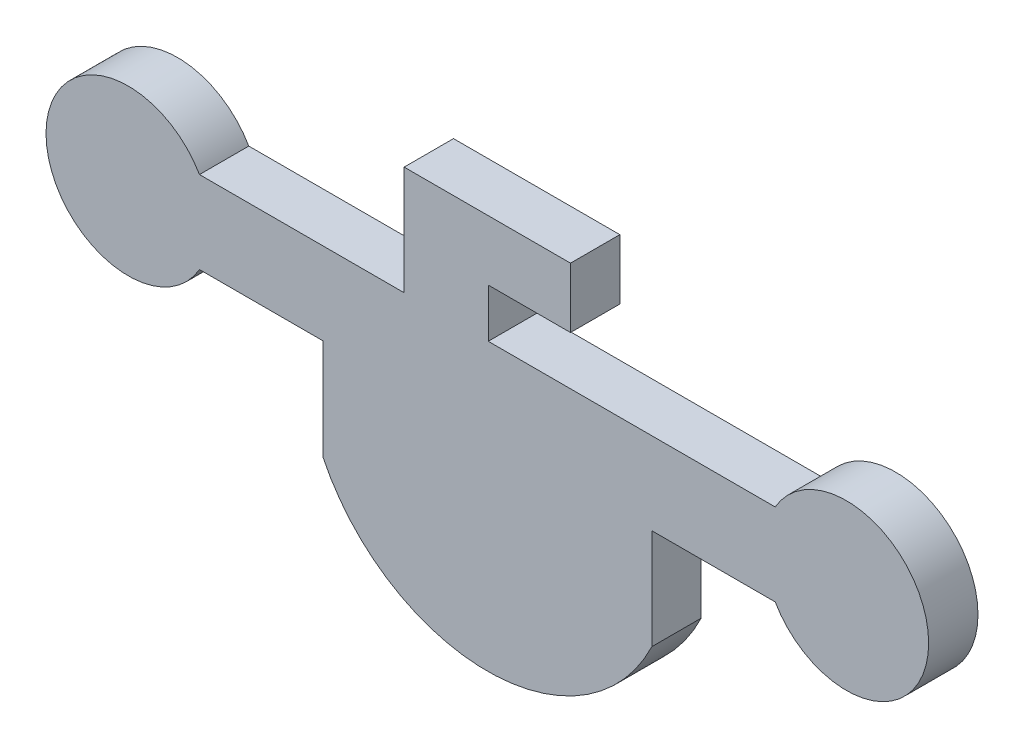
ISO-10303-21;
HEADER;
FILE_DESCRIPTION(('STEP AP214'),'2;1');
FILE_NAME('part.step','',(''),(''),'','','');
FILE_SCHEMA(('AUTOMOTIVE_DESIGN { 1 0 10303 214 1 1 1 1 }'));
ENDSEC;
DATA;
#1=APPLICATION_CONTEXT('core data for automotive mechanical design processes');
#2=APPLICATION_PROTOCOL_DEFINITION('international standard','automotive_design',2000,#1);
#3=PRODUCT_CONTEXT('',#1,'mechanical');
#4=PRODUCT('Part','Part','',(#3));
#5=PRODUCT_RELATED_PRODUCT_CATEGORY('part','',(#4));
#6=PRODUCT_DEFINITION_FORMATION('','',#4);
#7=PRODUCT_DEFINITION_CONTEXT('part definition',#1,'design');
#8=PRODUCT_DEFINITION('design','',#6,#7);
#9=PRODUCT_DEFINITION_SHAPE('','',#8);
#10=(LENGTH_UNIT() NAMED_UNIT(*) SI_UNIT(.MILLI.,.METRE.));
#11=(NAMED_UNIT(*) PLANE_ANGLE_UNIT() SI_UNIT($,.RADIAN.));
#12=(NAMED_UNIT(*) SI_UNIT($,.STERADIAN.) SOLID_ANGLE_UNIT());
#13=UNCERTAINTY_MEASURE_WITH_UNIT(LENGTH_MEASURE(1.E-05),#10,'distance_accuracy_value','');
#14=(GEOMETRIC_REPRESENTATION_CONTEXT(3) GLOBAL_UNCERTAINTY_ASSIGNED_CONTEXT((#13)) GLOBAL_UNIT_ASSIGNED_CONTEXT((#10,
#11,#12)) REPRESENTATION_CONTEXT('',''));
#15=CARTESIAN_POINT('',(0.,0.,0.));
#16=DIRECTION('',(0.,0.,1.));
#17=DIRECTION('',(1.,0.,0.));
#18=AXIS2_PLACEMENT_3D('',#15,#16,#17);
#19=CARTESIAN_POINT('',(-1351.28018653171,93.8998201263411,3.00000000000025));
#20=DIRECTION('',(1.,0.,0.));
#21=DIRECTION('',(0.,0.,-1.));
#22=AXIS2_PLACEMENT_3D('',#19,#20,#21);
#23=PLANE('',#22);
#24=DIRECTION('',(0.,-1.,0.));
#25=VECTOR('',#24,1.);
#26=CARTESIAN_POINT('',(-1351.28018653171,93.8998201263414,1.94289029309402E-13));
#27=LINE('',#26,#25);
#28=CARTESIAN_POINT('',(-1351.28018653171,100.515097097471,1.94289029309402E-13));
#29=VERTEX_POINT('',#28);
#30=CARTESIAN_POINT('',(-1351.28018653171,93.8998201263414,1.94289029309402E-13));
#31=VERTEX_POINT('',#30);
#32=EDGE_CURVE('E136',#29,#31,#27,.T.);
#33=ORIENTED_EDGE('',*,*,#32,.T.);
#34=DIRECTION('',(0.,0.,-1.));
#35=VECTOR('',#34,1.);
#36=CARTESIAN_POINT('',(-1351.28018653171,93.8998201263411,3.00000000000025));
#37=LINE('',#36,#35);
#38=CARTESIAN_POINT('',(-1351.28018653171,93.8998201263411,3.00000000000025));
#39=VERTEX_POINT('',#38);
#40=EDGE_CURVE('E11',#39,#31,#37,.T.);
#41=ORIENTED_EDGE('',*,*,#40,.F.);
#42=DIRECTION('',(0.,-1.,0.));
#43=VECTOR('',#42,1.);
#44=CARTESIAN_POINT('',(-1351.28018653171,93.8998201263411,3.00000000000025));
#45=LINE('',#44,#43);
#46=CARTESIAN_POINT('',(-1351.2801865317,100.515097097471,3.00000000000017));
#47=VERTEX_POINT('',#46);
#48=EDGE_CURVE('E175',#47,#39,#45,.T.);
#49=ORIENTED_EDGE('',*,*,#48,.F.);
#50=DIRECTION('',(0.,0.,-1.));
#51=VECTOR('',#50,1.);
#52=CARTESIAN_POINT('',(-1351.2801865317,100.515097097471,3.00000000000017));
#53=LINE('',#52,#51);
#54=EDGE_CURVE('E149',#47,#29,#53,.T.);
#55=ORIENTED_EDGE('',*,*,#54,.T.);
#56=EDGE_LOOP('',(#33,#41,#49,#55));
#57=FACE_BOUND('',#56,.T.);
#58=ADVANCED_FACE('F32',(#57),#23,.F.);
#59=CARTESIAN_POINT('',(-1363.72354833003,93.8998201263413,3.00000000000034));
#60=DIRECTION('',(0.,-1.,0.));
#61=DIRECTION('',(0.,0.,-1.));
#62=AXIS2_PLACEMENT_3D('',#59,#60,#61);
#63=PLANE('',#62);
#64=DIRECTION('',(-1.,0.,0.));
#65=VECTOR('',#64,1.);
#66=CARTESIAN_POINT('',(-1363.72354833003,93.8998201263413,2.4980018054066E-13));
#67=LINE('',#66,#65);
#68=CARTESIAN_POINT('',(-1363.72354833003,93.8998201263413,2.4980018054066E-13));
#69=VERTEX_POINT('',#68);
#70=EDGE_CURVE('E132',#31,#69,#67,.T.);
#71=ORIENTED_EDGE('',*,*,#70,.T.);
#72=DIRECTION('',(0.,0.,-1.));
#73=VECTOR('',#72,1.);
#74=CARTESIAN_POINT('',(-1363.72354833003,93.8998201263413,3.00000000000034));
#75=LINE('',#74,#73);
#76=CARTESIAN_POINT('',(-1363.72354833003,93.8998201263413,3.00000000000034));
#77=VERTEX_POINT('',#76);
#78=EDGE_CURVE('E39',#77,#69,#75,.T.);
#79=ORIENTED_EDGE('',*,*,#78,.F.);
#80=DIRECTION('',(-1.,0.,0.));
#81=VECTOR('',#80,1.);
#82=CARTESIAN_POINT('',(-1363.72354833003,93.8998201263413,3.00000000000034));
#83=LINE('',#82,#81);
#84=EDGE_CURVE('E145',#39,#77,#83,.T.);
#85=ORIENTED_EDGE('',*,*,#84,.F.);
#86=ORIENTED_EDGE('',*,*,#40,.T.);
#87=EDGE_LOOP('',(#71,#79,#85,#86));
#88=FACE_BOUND('',#87,.T.);
#89=ADVANCED_FACE('F144',(#88),#63,.F.);
#90=CARTESIAN_POINT('',(-1368.05367534895,91.3998201263413,3.00000000000025));
#91=DIRECTION('',(0.,0.,-1.));
#92=DIRECTION('',(-1.,0.,0.));
#93=AXIS2_PLACEMENT_3D('',#90,#91,#92);
#94=CYLINDRICAL_SURFACE('',#93,5.00000000000002);
#95=CARTESIAN_POINT('',(-1368.05367534895,91.3998201263412,2.4980018054066E-13));
#96=DIRECTION('',(0.,0.,1.));
#97=DIRECTION('',(1.,0.,0.));
#98=AXIS2_PLACEMENT_3D('',#95,#96,#97);
#99=CIRCLE('',#98,5.00000000000002);
#100=CARTESIAN_POINT('',(-1363.72354833003,88.8998201263413,2.4980018054066E-13));
#101=VERTEX_POINT('',#100);
#102=EDGE_CURVE('E138',#69,#101,#99,.T.);
#103=ORIENTED_EDGE('',*,*,#102,.T.);
#104=DIRECTION('',(0.,0.,-1.));
#105=VECTOR('',#104,1.);
#106=CARTESIAN_POINT('',(-1363.72354833003,88.8998201263413,3.00000000000028));
#107=LINE('',#106,#105);
#108=CARTESIAN_POINT('',(-1363.72354833003,88.8998201263413,3.00000000000028));
#109=VERTEX_POINT('',#108);
#110=EDGE_CURVE('E231',#109,#101,#107,.T.);
#111=ORIENTED_EDGE('',*,*,#110,.F.);
#112=CARTESIAN_POINT('',(-1368.05367534895,91.3998201263413,3.00000000000025));
#113=DIRECTION('',(0.,0.,1.));
#114=DIRECTION('',(1.,0.,0.));
#115=AXIS2_PLACEMENT_3D('',#112,#113,#114);
#116=CIRCLE('',#115,5.00000000000002);
#117=EDGE_CURVE('E178',#77,#109,#116,.T.);
#118=ORIENTED_EDGE('',*,*,#117,.F.);
#119=ORIENTED_EDGE('',*,*,#78,.T.);
#120=EDGE_LOOP('',(#103,#111,#118,#119));
#121=FACE_BOUND('',#120,.T.);
#122=ADVANCED_FACE('F235',(#121),#94,.T.);
#123=CARTESIAN_POINT('',(-1363.72354833003,88.8998201263413,3.00000000000028));
#124=DIRECTION('',(0.,1.,0.));
#125=DIRECTION('',(0.,0.,1.));
#126=AXIS2_PLACEMENT_3D('',#123,#124,#125);
#127=PLANE('',#126);
#128=DIRECTION('',(1.,0.,0.));
#129=VECTOR('',#128,1.);
#130=CARTESIAN_POINT('',(-1363.72354833003,88.8998201263413,2.4980018054066E-13));
#131=LINE('',#130,#129);
#132=CARTESIAN_POINT('',(-1356.22354833003,88.8998201263413,3.33066907387547E-13));
#133=VERTEX_POINT('',#132);
#134=EDGE_CURVE('E153',#101,#133,#131,.T.);
#135=ORIENTED_EDGE('',*,*,#134,.T.);
#136=DIRECTION('',(0.,0.,-1.));
#137=VECTOR('',#136,1.);
#138=CARTESIAN_POINT('',(-1356.22354833003,88.8998201263413,3.00000000000028));
#139=LINE('',#138,#137);
#140=CARTESIAN_POINT('',(-1356.22354833003,88.8998201263413,3.00000000000028));
#141=VERTEX_POINT('',#140);
#142=EDGE_CURVE('E228',#141,#133,#139,.T.);
#143=ORIENTED_EDGE('',*,*,#142,.F.);
#144=DIRECTION('',(1.,0.,0.));
#145=VECTOR('',#144,1.);
#146=CARTESIAN_POINT('',(-1363.72354833003,88.8998201263413,3.00000000000028));
#147=LINE('',#146,#145);
#148=EDGE_CURVE('E180',#109,#141,#147,.T.);
#149=ORIENTED_EDGE('',*,*,#148,.F.);
#150=ORIENTED_EDGE('',*,*,#110,.T.);
#151=EDGE_LOOP('',(#135,#143,#149,#150));
#152=FACE_BOUND('',#151,.T.);
#153=ADVANCED_FACE('F243',(#152),#127,.F.);
#154=CARTESIAN_POINT('',(-1356.22354833003,82.7934375151063,3.00000000000017));
#155=DIRECTION('',(1.,0.,0.));
#156=DIRECTION('',(0.,0.,-1.));
#157=AXIS2_PLACEMENT_3D('',#154,#155,#156);
#158=PLANE('',#157);
#159=DIRECTION('',(0.,-1.,0.));
#160=VECTOR('',#159,1.);
#161=CARTESIAN_POINT('',(-1356.22354833003,82.7934375151063,3.33066907387547E-13));
#162=LINE('',#161,#160);
#163=CARTESIAN_POINT('',(-1356.22354833003,82.7934375151063,3.33066907387547E-13));
#164=VERTEX_POINT('',#163);
#165=EDGE_CURVE('E155',#133,#164,#162,.T.);
#166=ORIENTED_EDGE('',*,*,#165,.T.);
#167=DIRECTION('',(0.,0.,-1.));
#168=VECTOR('',#167,1.);
#169=CARTESIAN_POINT('',(-1356.22354833003,82.7934375151063,3.00000000000017));
#170=LINE('',#169,#168);
#171=CARTESIAN_POINT('',(-1356.22354833003,82.7934375151063,3.00000000000017));
#172=VERTEX_POINT('',#171);
#173=EDGE_CURVE('E225',#172,#164,#170,.T.);
#174=ORIENTED_EDGE('',*,*,#173,.F.);
#175=DIRECTION('',(0.,-1.,0.));
#176=VECTOR('',#175,1.);
#177=CARTESIAN_POINT('',(-1356.22354833003,82.7934375151063,3.00000000000017));
#178=LINE('',#177,#176);
#179=EDGE_CURVE('E182',#141,#172,#178,.T.);
#180=ORIENTED_EDGE('',*,*,#179,.F.);
#181=ORIENTED_EDGE('',*,*,#142,.T.);
#182=EDGE_LOOP('',(#166,#174,#180,#181));
#183=FACE_BOUND('',#182,.T.);
#184=ADVANCED_FACE('F246',(#183),#158,.F.);
#185=CARTESIAN_POINT('',(-1346.22354833003,87.5993501758886,3.00000000000045));
#186=DIRECTION('',(0.,0.,-1.));
#187=DIRECTION('',(-1.,0.,0.));
#188=AXIS2_PLACEMENT_3D('',#185,#186,#187);
#189=CYLINDRICAL_SURFACE('',#188,11.094899571563);
#190=CARTESIAN_POINT('',(-1346.22354833003,87.5993501758885,3.05311331771918E-13));
#191=DIRECTION('',(0.,0.,1.));
#192=DIRECTION('',(1.,0.,0.));
#193=AXIS2_PLACEMENT_3D('',#190,#191,#192);
#194=CIRCLE('',#193,11.094899571563);
#195=CARTESIAN_POINT('',(-1336.22354833003,82.7934375151063,4.44089209850063E-13));
#196=VERTEX_POINT('',#195);
#197=EDGE_CURVE('E157',#164,#196,#194,.T.);
#198=ORIENTED_EDGE('',*,*,#197,.T.);
#199=DIRECTION('',(0.,0.,-1.));
#200=VECTOR('',#199,1.);
#201=CARTESIAN_POINT('',(-1336.22354833003,82.7934375151063,3.00000000000039));
#202=LINE('',#201,#200);
#203=CARTESIAN_POINT('',(-1336.22354833003,82.7934375151063,3.00000000000039));
#204=VERTEX_POINT('',#203);
#205=EDGE_CURVE('E222',#204,#196,#202,.T.);
#206=ORIENTED_EDGE('',*,*,#205,.F.);
#207=CARTESIAN_POINT('',(-1346.22354833003,87.5993501758886,3.00000000000045));
#208=DIRECTION('',(0.,0.,1.));
#209=DIRECTION('',(1.,0.,0.));
#210=AXIS2_PLACEMENT_3D('',#207,#208,#209);
#211=CIRCLE('',#210,11.094899571563);
#212=EDGE_CURVE('E184',#172,#204,#211,.T.);
#213=ORIENTED_EDGE('',*,*,#212,.F.);
#214=ORIENTED_EDGE('',*,*,#173,.T.);
#215=EDGE_LOOP('',(#198,#206,#213,#214));
#216=FACE_BOUND('',#215,.T.);
#217=ADVANCED_FACE('F251',(#216),#189,.T.);
#218=CARTESIAN_POINT('',(-1336.22354833003,82.7934375151063,3.00000000000039));
#219=DIRECTION('',(-1.,0.,0.));
#220=DIRECTION('',(0.,0.,1.));
#221=AXIS2_PLACEMENT_3D('',#218,#219,#220);
#222=PLANE('',#221);
#223=DIRECTION('',(0.,1.,0.));
#224=VECTOR('',#223,1.);
#225=CARTESIAN_POINT('',(-1336.22354833003,82.7934375151063,4.44089209850063E-13));
#226=LINE('',#225,#224);
#227=CARTESIAN_POINT('',(-1336.22354833003,88.8998201263412,4.71844785465692E-13));
#228=VERTEX_POINT('',#227);
#229=EDGE_CURVE('E159',#196,#228,#226,.T.);
#230=ORIENTED_EDGE('',*,*,#229,.T.);
#231=DIRECTION('',(0.,0.,-1.));
#232=VECTOR('',#231,1.);
#233=CARTESIAN_POINT('',(-1336.22354833003,88.8998201263413,3.00000000000034));
#234=LINE('',#233,#232);
#235=CARTESIAN_POINT('',(-1336.22354833003,88.8998201263413,3.00000000000034));
#236=VERTEX_POINT('',#235);
#237=EDGE_CURVE('E219',#236,#228,#234,.T.);
#238=ORIENTED_EDGE('',*,*,#237,.F.);
#239=DIRECTION('',(0.,1.,0.));
#240=VECTOR('',#239,1.);
#241=CARTESIAN_POINT('',(-1336.22354833003,82.7934375151063,3.00000000000039));
#242=LINE('',#241,#240);
#243=EDGE_CURVE('E186',#204,#236,#242,.T.);
#244=ORIENTED_EDGE('',*,*,#243,.F.);
#245=ORIENTED_EDGE('',*,*,#205,.T.);
#246=EDGE_LOOP('',(#230,#238,#244,#245));
#247=FACE_BOUND('',#246,.T.);
#248=ADVANCED_FACE('F257',(#247),#222,.F.);
#249=CARTESIAN_POINT('',(-1336.22354833003,88.8998201263413,3.00000000000034));
#250=DIRECTION('',(0.,1.,0.));
#251=DIRECTION('',(0.,0.,1.));
#252=AXIS2_PLACEMENT_3D('',#249,#250,#251);
#253=PLANE('',#252);
#254=DIRECTION('',(1.,0.,0.));
#255=VECTOR('',#254,1.);
#256=CARTESIAN_POINT('',(-1336.22354833003,88.8998201263412,4.71844785465692E-13));
#257=LINE('',#256,#255);
#258=CARTESIAN_POINT('',(-1328.72354833003,88.8998201263412,1.11022302462516E-13));
#259=VERTEX_POINT('',#258);
#260=EDGE_CURVE('E161',#228,#259,#257,.T.);
#261=ORIENTED_EDGE('',*,*,#260,.T.);
#262=DIRECTION('',(0.,0.,-1.));
#263=VECTOR('',#262,1.);
#264=CARTESIAN_POINT('',(-1328.72354833003,88.8998201263413,3.00000000000017));
#265=LINE('',#264,#263);
#266=CARTESIAN_POINT('',(-1328.72354833003,88.8998201263413,3.00000000000017));
#267=VERTEX_POINT('',#266);
#268=EDGE_CURVE('E216',#267,#259,#265,.T.);
#269=ORIENTED_EDGE('',*,*,#268,.F.);
#270=DIRECTION('',(1.,0.,0.));
#271=VECTOR('',#270,1.);
#272=CARTESIAN_POINT('',(-1336.22354833003,88.8998201263413,3.00000000000034));
#273=LINE('',#272,#271);
#274=EDGE_CURVE('E188',#236,#267,#273,.T.);
#275=ORIENTED_EDGE('',*,*,#274,.F.);
#276=ORIENTED_EDGE('',*,*,#237,.T.);
#277=EDGE_LOOP('',(#261,#269,#275,#276));
#278=FACE_BOUND('',#277,.T.);
#279=ADVANCED_FACE('F261',(#278),#253,.F.);
#280=CARTESIAN_POINT('',(-1324.39342131111,91.3998201263414,3.00000000000014));
#281=DIRECTION('',(0.,0.,-1.));
#282=DIRECTION('',(-1.,0.,0.));
#283=AXIS2_PLACEMENT_3D('',#280,#281,#282);
#284=CYLINDRICAL_SURFACE('',#283,5.00000000000002);
#285=CARTESIAN_POINT('',(-1324.39342131111,91.3998201263413,1.94289029309402E-13));
#286=DIRECTION('',(0.,0.,1.));
#287=DIRECTION('',(-1.,0.,0.));
#288=AXIS2_PLACEMENT_3D('',#285,#286,#287);
#289=CIRCLE('',#288,5.00000000000002);
#290=CARTESIAN_POINT('',(-1328.72354833003,93.8998201263414,0.));
#291=VERTEX_POINT('',#290);
#292=EDGE_CURVE('E163',#259,#291,#289,.T.);
#293=ORIENTED_EDGE('',*,*,#292,.T.);
#294=DIRECTION('',(0.,0.,-1.));
#295=VECTOR('',#294,1.);
#296=CARTESIAN_POINT('',(-1328.72354833003,93.8998201263413,3.00000000000017));
#297=LINE('',#296,#295);
#298=CARTESIAN_POINT('',(-1328.72354833003,93.8998201263413,3.00000000000017));
#299=VERTEX_POINT('',#298);
#300=EDGE_CURVE('E213',#299,#291,#297,.T.);
#301=ORIENTED_EDGE('',*,*,#300,.F.);
#302=CARTESIAN_POINT('',(-1324.39342131111,91.3998201263414,3.00000000000014));
#303=DIRECTION('',(0.,0.,1.));
#304=DIRECTION('',(-1.,0.,0.));
#305=AXIS2_PLACEMENT_3D('',#302,#303,#304);
#306=CIRCLE('',#305,5.00000000000002);
#307=EDGE_CURVE('E190',#267,#299,#306,.T.);
#308=ORIENTED_EDGE('',*,*,#307,.F.);
#309=ORIENTED_EDGE('',*,*,#268,.T.);
#310=EDGE_LOOP('',(#293,#301,#308,#309));
#311=FACE_BOUND('',#310,.T.);
#312=ADVANCED_FACE('F266',(#311),#284,.T.);
#313=CARTESIAN_POINT('',(-1328.72354833003,93.8998201263413,3.00000000000017));
#314=DIRECTION('',(0.,-1.,0.));
#315=DIRECTION('',(0.,0.,-1.));
#316=AXIS2_PLACEMENT_3D('',#313,#314,#315);
#317=PLANE('',#316);
#318=DIRECTION('',(-1.,0.,0.));
#319=VECTOR('',#318,1.);
#320=CARTESIAN_POINT('',(-1328.72354833003,93.8998201263414,0.));
#321=LINE('',#320,#319);
#322=CARTESIAN_POINT('',(-1346.16691012836,93.8998201263413,1.38777878078145E-13));
#323=VERTEX_POINT('',#322);
#324=EDGE_CURVE('E165',#291,#323,#321,.T.);
#325=ORIENTED_EDGE('',*,*,#324,.T.);
#326=DIRECTION('',(0.,0.,-1.));
#327=VECTOR('',#326,1.);
#328=CARTESIAN_POINT('',(-1346.16691012836,93.8998201263414,3.00000000000014));
#329=LINE('',#328,#327);
#330=CARTESIAN_POINT('',(-1346.16691012836,93.8998201263414,3.00000000000014));
#331=VERTEX_POINT('',#330);
#332=EDGE_CURVE('E210',#331,#323,#329,.T.);
#333=ORIENTED_EDGE('',*,*,#332,.F.);
#334=DIRECTION('',(-1.,0.,0.));
#335=VECTOR('',#334,1.);
#336=CARTESIAN_POINT('',(-1328.72354833003,93.8998201263413,3.00000000000017));
#337=LINE('',#336,#335);
#338=EDGE_CURVE('E192',#299,#331,#337,.T.);
#339=ORIENTED_EDGE('',*,*,#338,.F.);
#340=ORIENTED_EDGE('',*,*,#300,.T.);
#341=EDGE_LOOP('',(#325,#333,#339,#340));
#342=FACE_BOUND('',#341,.T.);
#343=ADVANCED_FACE('F272',(#342),#317,.F.);
#344=CARTESIAN_POINT('',(-1346.16691012836,96.8610733291439,3.00000000000017));
#345=DIRECTION('',(-1.,0.,0.));
#346=DIRECTION('',(0.,0.,1.));
#347=AXIS2_PLACEMENT_3D('',#344,#345,#346);
#348=PLANE('',#347);
#349=DIRECTION('',(0.,1.,0.));
#350=VECTOR('',#349,1.);
#351=CARTESIAN_POINT('',(-1346.16691012836,96.8610733291438,1.66533453693773E-13));
#352=LINE('',#351,#350);
#353=CARTESIAN_POINT('',(-1346.16691012836,96.8610733291438,1.66533453693773E-13));
#354=VERTEX_POINT('',#353);
#355=EDGE_CURVE('E167',#323,#354,#352,.T.);
#356=ORIENTED_EDGE('',*,*,#355,.T.);
#357=DIRECTION('',(0.,0.,-1.));
#358=VECTOR('',#357,1.);
#359=CARTESIAN_POINT('',(-1346.16691012836,96.8610733291439,3.00000000000017));
#360=LINE('',#359,#358);
#361=CARTESIAN_POINT('',(-1346.16691012836,96.8610733291439,3.00000000000017));
#362=VERTEX_POINT('',#361);
#363=EDGE_CURVE('E207',#362,#354,#360,.T.);
#364=ORIENTED_EDGE('',*,*,#363,.F.);
#365=DIRECTION('',(0.,1.,0.));
#366=VECTOR('',#365,1.);
#367=CARTESIAN_POINT('',(-1346.16691012836,96.8610733291439,3.00000000000017));
#368=LINE('',#367,#366);
#369=EDGE_CURVE('E194',#331,#362,#368,.T.);
#370=ORIENTED_EDGE('',*,*,#369,.F.);
#371=ORIENTED_EDGE('',*,*,#332,.T.);
#372=EDGE_LOOP('',(#356,#364,#370,#371));
#373=FACE_BOUND('',#372,.T.);
#374=ADVANCED_FACE('F276',(#373),#348,.F.);
#375=CARTESIAN_POINT('',(-1341.16691012836,96.8610733291437,3.00000000000017));
#376=DIRECTION('',(0.,1.,0.));
#377=DIRECTION('',(0.,0.,1.));
#378=AXIS2_PLACEMENT_3D('',#375,#376,#377);
#379=PLANE('',#378);
#380=DIRECTION('',(1.,0.,0.));
#381=VECTOR('',#380,1.);
#382=CARTESIAN_POINT('',(-1341.16691012836,96.8610733291438,1.66533453693773E-13));
#383=LINE('',#382,#381);
#384=CARTESIAN_POINT('',(-1341.16691012836,96.8610733291438,1.66533453693773E-13));
#385=VERTEX_POINT('',#384);
#386=EDGE_CURVE('E169',#354,#385,#383,.T.);
#387=ORIENTED_EDGE('',*,*,#386,.T.);
#388=DIRECTION('',(0.,0.,-1.));
#389=VECTOR('',#388,1.);
#390=CARTESIAN_POINT('',(-1341.16691012836,96.8610733291437,3.00000000000017));
#391=LINE('',#390,#389);
#392=CARTESIAN_POINT('',(-1341.16691012836,96.8610733291437,3.00000000000017));
#393=VERTEX_POINT('',#392);
#394=EDGE_CURVE('E204',#393,#385,#391,.T.);
#395=ORIENTED_EDGE('',*,*,#394,.F.);
#396=DIRECTION('',(1.,0.,0.));
#397=VECTOR('',#396,1.);
#398=CARTESIAN_POINT('',(-1341.16691012836,96.8610733291437,3.00000000000017));
#399=LINE('',#398,#397);
#400=EDGE_CURVE('E196',#362,#393,#399,.T.);
#401=ORIENTED_EDGE('',*,*,#400,.F.);
#402=ORIENTED_EDGE('',*,*,#363,.T.);
#403=EDGE_LOOP('',(#387,#395,#401,#402));
#404=FACE_BOUND('',#403,.T.);
#405=ADVANCED_FACE('F281',(#404),#379,.F.);
#406=CARTESIAN_POINT('',(-1341.16691012836,100.515097097471,3.00000000000009));
#407=DIRECTION('',(-1.,0.,0.));
#408=DIRECTION('',(0.,0.,1.));
#409=AXIS2_PLACEMENT_3D('',#406,#407,#408);
#410=PLANE('',#409);
#411=DIRECTION('',(0.,1.,0.));
#412=VECTOR('',#411,1.);
#413=CARTESIAN_POINT('',(-1341.16691012836,100.515097097471,2.22044604925031E-13));
#414=LINE('',#413,#412);
#415=CARTESIAN_POINT('',(-1341.16691012836,100.515097097471,2.22044604925031E-13));
#416=VERTEX_POINT('',#415);
#417=EDGE_CURVE('E171',#385,#416,#414,.T.);
#418=ORIENTED_EDGE('',*,*,#417,.T.);
#419=DIRECTION('',(0.,0.,-1.));
#420=VECTOR('',#419,1.);
#421=CARTESIAN_POINT('',(-1341.16691012836,100.515097097471,3.00000000000009));
#422=LINE('',#421,#420);
#423=CARTESIAN_POINT('',(-1341.16691012836,100.515097097471,3.00000000000009));
#424=VERTEX_POINT('',#423);
#425=EDGE_CURVE('E201',#424,#416,#422,.T.);
#426=ORIENTED_EDGE('',*,*,#425,.F.);
#427=DIRECTION('',(0.,1.,0.));
#428=VECTOR('',#427,1.);
#429=CARTESIAN_POINT('',(-1341.16691012836,100.515097097471,3.00000000000009));
#430=LINE('',#429,#428);
#431=EDGE_CURVE('E51',#393,#424,#430,.T.);
#432=ORIENTED_EDGE('',*,*,#431,.F.);
#433=ORIENTED_EDGE('',*,*,#394,.T.);
#434=EDGE_LOOP('',(#418,#426,#432,#433));
#435=FACE_BOUND('',#434,.T.);
#436=ADVANCED_FACE('F284',(#435),#410,.F.);
#437=CARTESIAN_POINT('',(-1351.2801865317,100.515097097471,3.00000000000017));
#438=DIRECTION('',(0.,-1.,0.));
#439=DIRECTION('',(0.,0.,-1.));
#440=AXIS2_PLACEMENT_3D('',#437,#438,#439);
#441=PLANE('',#440);
#442=DIRECTION('',(-1.,0.,0.));
#443=VECTOR('',#442,1.);
#444=CARTESIAN_POINT('',(-1351.28018653171,100.515097097471,1.94289029309402E-13));
#445=LINE('',#444,#443);
#446=EDGE_CURVE('E173',#416,#29,#445,.T.);
#447=ORIENTED_EDGE('',*,*,#446,.T.);
#448=ORIENTED_EDGE('',*,*,#54,.F.);
#449=DIRECTION('',(-1.,0.,0.));
#450=VECTOR('',#449,1.);
#451=CARTESIAN_POINT('',(-1351.2801865317,100.515097097471,3.00000000000017));
#452=LINE('',#451,#450);
#453=EDGE_CURVE('E46',#424,#47,#452,.T.);
#454=ORIENTED_EDGE('',*,*,#453,.F.);
#455=ORIENTED_EDGE('',*,*,#425,.T.);
#456=EDGE_LOOP('',(#447,#448,#454,#455));
#457=FACE_BOUND('',#456,.T.);
#458=ADVANCED_FACE('F286',(#457),#441,.F.);
#459=CARTESIAN_POINT('',(-1324.39342131111,91.3998201263414,3.00000000000014));
#460=DIRECTION('',(0.,0.,-1.));
#461=DIRECTION('',(-1.,0.,0.));
#462=AXIS2_PLACEMENT_3D('',#459,#460,#461);
#463=PLANE('',#462);
#464=ORIENTED_EDGE('',*,*,#48,.T.);
#465=ORIENTED_EDGE('',*,*,#84,.T.);
#466=ORIENTED_EDGE('',*,*,#117,.T.);
#467=ORIENTED_EDGE('',*,*,#148,.T.);
#468=ORIENTED_EDGE('',*,*,#179,.T.);
#469=ORIENTED_EDGE('',*,*,#212,.T.);
#470=ORIENTED_EDGE('',*,*,#243,.T.);
#471=ORIENTED_EDGE('',*,*,#274,.T.);
#472=ORIENTED_EDGE('',*,*,#307,.T.);
#473=ORIENTED_EDGE('',*,*,#338,.T.);
#474=ORIENTED_EDGE('',*,*,#369,.T.);
#475=ORIENTED_EDGE('',*,*,#400,.T.);
#476=ORIENTED_EDGE('',*,*,#431,.T.);
#477=ORIENTED_EDGE('',*,*,#453,.T.);
#478=EDGE_LOOP('',(#464,#465,#466,#467,#468,#469,#470,#471,#472,#473,#474,#475,#476,#477));
#479=FACE_BOUND('',#478,.T.);
#480=ADVANCED_FACE('F238',(#479),#463,.F.);
#481=CARTESIAN_POINT('',(-1324.39342131111,91.3998201263413,1.94289029309402E-13));
#482=DIRECTION('',(0.,0.,-1.));
#483=DIRECTION('',(-1.,0.,0.));
#484=AXIS2_PLACEMENT_3D('',#481,#482,#483);
#485=PLANE('',#484);
#486=ORIENTED_EDGE('',*,*,#32,.F.);
#487=ORIENTED_EDGE('',*,*,#446,.F.);
#488=ORIENTED_EDGE('',*,*,#417,.F.);
#489=ORIENTED_EDGE('',*,*,#386,.F.);
#490=ORIENTED_EDGE('',*,*,#355,.F.);
#491=ORIENTED_EDGE('',*,*,#324,.F.);
#492=ORIENTED_EDGE('',*,*,#292,.F.);
#493=ORIENTED_EDGE('',*,*,#260,.F.);
#494=ORIENTED_EDGE('',*,*,#229,.F.);
#495=ORIENTED_EDGE('',*,*,#197,.F.);
#496=ORIENTED_EDGE('',*,*,#165,.F.);
#497=ORIENTED_EDGE('',*,*,#134,.F.);
#498=ORIENTED_EDGE('',*,*,#102,.F.);
#499=ORIENTED_EDGE('',*,*,#70,.F.);
#500=EDGE_LOOP('',(#486,#487,#488,#489,#490,#491,#492,#493,#494,#495,#496,#497,#498,#499));
#501=FACE_BOUND('',#500,.T.);
#502=ADVANCED_FACE('F133',(#501),#485,.T.);
#503=CLOSED_SHELL('',(#58,#89,#122,#153,#184,#217,#248,#279,#312,#343,#374,#405,#436,#458,#480,#502));
#504=MANIFOLD_SOLID_BREP('B2',#503);
#505=ADVANCED_BREP_SHAPE_REPRESENTATION('',(#18,#504),#14);
#506=SHAPE_DEFINITION_REPRESENTATION(#9,#505);
ENDSEC;
END-ISO-10303-21;
